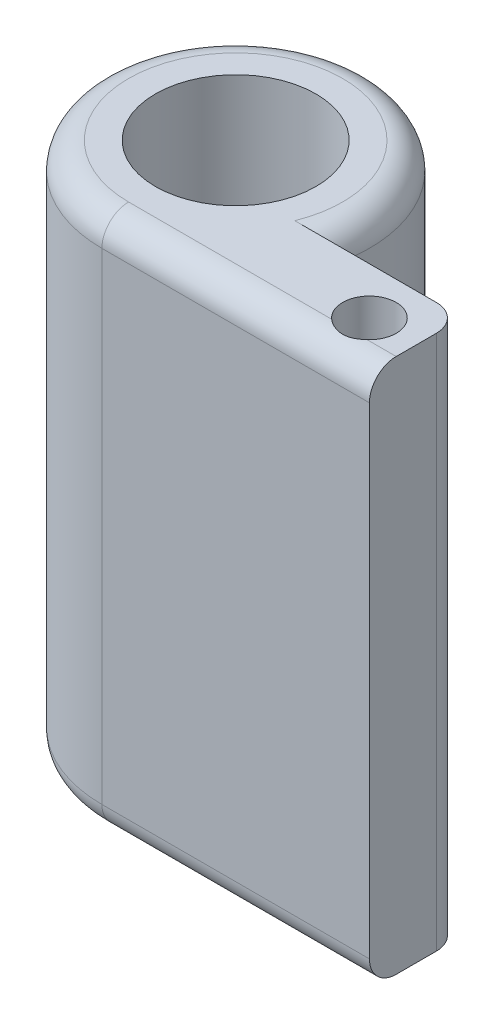
ISO-10303-21;
HEADER;
FILE_DESCRIPTION(('STEP AP214'),'2;1');
FILE_NAME('part.step','',(''),(''),'','','');
FILE_SCHEMA(('AUTOMOTIVE_DESIGN { 1 0 10303 214 1 1 1 1 }'));
ENDSEC;
DATA;
#1=APPLICATION_CONTEXT('core data for automotive mechanical design processes');
#2=APPLICATION_PROTOCOL_DEFINITION('international standard','automotive_design',2000,#1);
#3=PRODUCT_CONTEXT('',#1,'mechanical');
#4=PRODUCT('Part','Part','',(#3));
#5=PRODUCT_RELATED_PRODUCT_CATEGORY('part','',(#4));
#6=PRODUCT_DEFINITION_FORMATION('','',#4);
#7=PRODUCT_DEFINITION_CONTEXT('part definition',#1,'design');
#8=PRODUCT_DEFINITION('design','',#6,#7);
#9=PRODUCT_DEFINITION_SHAPE('','',#8);
#10=(LENGTH_UNIT() NAMED_UNIT(*) SI_UNIT(.MILLI.,.METRE.));
#11=(NAMED_UNIT(*) PLANE_ANGLE_UNIT() SI_UNIT($,.RADIAN.));
#12=(NAMED_UNIT(*) SI_UNIT($,.STERADIAN.) SOLID_ANGLE_UNIT());
#13=UNCERTAINTY_MEASURE_WITH_UNIT(LENGTH_MEASURE(1.E-05),#10,'distance_accuracy_value','');
#14=(GEOMETRIC_REPRESENTATION_CONTEXT(3) GLOBAL_UNCERTAINTY_ASSIGNED_CONTEXT((#13)) GLOBAL_UNIT_ASSIGNED_CONTEXT((#10,
#11,#12)) REPRESENTATION_CONTEXT('',''));
#15=CARTESIAN_POINT('',(0.,0.,0.));
#16=DIRECTION('',(0.,0.,1.));
#17=DIRECTION('',(1.,0.,0.));
#18=AXIS2_PLACEMENT_3D('',#15,#16,#17);
#19=CARTESIAN_POINT('',(0.,50.8,0.));
#20=DIRECTION('',(0.,-1.,0.));
#21=DIRECTION('',(0.,0.,-1.));
#22=AXIS2_PLACEMENT_3D('',#19,#20,#21);
#23=CYLINDRICAL_SURFACE('',#22,12.7);
#24=DIRECTION('',(0.,-1.,0.));
#25=VECTOR('',#24,1.);
#26=CARTESIAN_POINT('',(12.1150278579952,50.8,3.81));
#27=LINE('',#26,#25);
#28=CARTESIAN_POINT('',(12.1150278579952,2.54,3.81));
#29=VERTEX_POINT('',#28);
#30=CARTESIAN_POINT('',(12.1150278579952,48.26,3.81));
#31=VERTEX_POINT('',#30);
#32=EDGE_CURVE('E151',#29,#31,#27,.F.);
#33=ORIENTED_EDGE('',*,*,#32,.F.);
#34=CARTESIAN_POINT('',(0.,2.54,0.));
#35=DIRECTION('',(0.,1.,0.));
#36=DIRECTION('',(0.,0.,1.));
#37=AXIS2_PLACEMENT_3D('',#34,#35,#36);
#38=CIRCLE('',#37,12.7);
#39=CARTESIAN_POINT('',(0.,2.54,12.7));
#40=VERTEX_POINT('',#39);
#41=EDGE_CURVE('E236',#29,#40,#38,.T.);
#42=ORIENTED_EDGE('',*,*,#41,.T.);
#43=DIRECTION('',(0.,-1.,0.));
#44=VECTOR('',#43,1.);
#45=CARTESIAN_POINT('',(0.,50.8,12.7));
#46=LINE('',#45,#44);
#47=CARTESIAN_POINT('',(0.,48.26,12.7));
#48=VERTEX_POINT('',#47);
#49=EDGE_CURVE('E130',#48,#40,#46,.T.);
#50=ORIENTED_EDGE('',*,*,#49,.F.);
#51=CARTESIAN_POINT('',(0.,48.26,0.));
#52=DIRECTION('',(0.,1.,0.));
#53=DIRECTION('',(0.,0.,1.));
#54=AXIS2_PLACEMENT_3D('',#51,#52,#53);
#55=CIRCLE('',#54,12.7);
#56=EDGE_CURVE('E237',#48,#31,#55,.F.);
#57=ORIENTED_EDGE('',*,*,#56,.T.);
#58=EDGE_LOOP('',(#33,#42,#50,#57));
#59=FACE_BOUND('',#58,.T.);
#60=ADVANCED_FACE('F33',(#59),#23,.T.);
#61=CARTESIAN_POINT('',(0.,50.8,0.));
#62=DIRECTION('',(0.,1.,0.));
#63=DIRECTION('',(0.,0.,1.));
#64=AXIS2_PLACEMENT_3D('',#61,#62,#63);
#65=PLANE('',#64);
#66=CARTESIAN_POINT('',(0.,50.8,0.));
#67=DIRECTION('',(0.,1.,0.));
#68=DIRECTION('',(0.,0.,1.));
#69=AXIS2_PLACEMENT_3D('',#66,#67,#68);
#70=CIRCLE('',#69,7.62);
#71=CARTESIAN_POINT('',(0.,50.8,7.62));
#72=VERTEX_POINT('',#71);
#73=EDGE_CURVE('E140',#72,#72,#70,.T.);
#74=ORIENTED_EDGE('',*,*,#73,.F.);
#75=EDGE_LOOP('',(#74));
#76=FACE_BOUND('',#75,.T.);
#77=DIRECTION('',(0.,0.,1.));
#78=VECTOR('',#77,1.);
#79=CARTESIAN_POINT('',(25.4,50.8,12.7));
#80=LINE('',#79,#78);
#81=CARTESIAN_POINT('',(25.4,50.8,6.35));
#82=VERTEX_POINT('',#81);
#83=CARTESIAN_POINT('',(25.4,50.8,10.16));
#84=VERTEX_POINT('',#83);
#85=EDGE_CURVE('E134',#82,#84,#80,.T.);
#86=ORIENTED_EDGE('',*,*,#85,.F.);
#87=CARTESIAN_POINT('',(22.86,50.8,6.35));
#88=DIRECTION('',(0.,1.,0.));
#89=DIRECTION('',(0.,0.,1.));
#90=AXIS2_PLACEMENT_3D('',#87,#88,#89);
#91=CIRCLE('',#90,2.54);
#92=CARTESIAN_POINT('',(22.86,50.8,3.81));
#93=VERTEX_POINT('',#92);
#94=EDGE_CURVE('E55',#82,#93,#91,.T.);
#95=ORIENTED_EDGE('',*,*,#94,.T.);
#96=DIRECTION('',(-1.,0.,0.));
#97=VECTOR('',#96,1.);
#98=CARTESIAN_POINT('',(25.4,50.8,3.81));
#99=LINE('',#98,#97);
#100=CARTESIAN_POINT('',(9.41857207861149,50.8,3.81));
#101=VERTEX_POINT('',#100);
#102=EDGE_CURVE('E149',#93,#101,#99,.T.);
#103=ORIENTED_EDGE('',*,*,#102,.T.);
#104=CARTESIAN_POINT('',(0.,50.8,0.));
#105=DIRECTION('',(0.,1.,0.));
#106=DIRECTION('',(0.,0.,1.));
#107=AXIS2_PLACEMENT_3D('',#104,#105,#106);
#108=CIRCLE('',#107,10.16);
#109=CARTESIAN_POINT('',(0.,50.8,10.16));
#110=VERTEX_POINT('',#109);
#111=EDGE_CURVE('E246',#101,#110,#108,.T.);
#112=ORIENTED_EDGE('',*,*,#111,.T.);
#113=DIRECTION('',(-1.,0.,0.));
#114=VECTOR('',#113,1.);
#115=CARTESIAN_POINT('',(25.4,50.8,10.16));
#116=LINE('',#115,#114);
#117=CARTESIAN_POINT('',(19.2749479174741,50.8,10.16));
#118=VERTEX_POINT('',#117);
#119=EDGE_CURVE('E244',#110,#118,#116,.F.);
#120=ORIENTED_EDGE('',*,*,#119,.T.);
#121=CARTESIAN_POINT('',(20.9550000000001,50.8,8.255));
#122=DIRECTION('',(0.,1.,0.));
#123=DIRECTION('',(0.,0.,1.));
#124=AXIS2_PLACEMENT_3D('',#121,#122,#123);
#125=CIRCLE('',#124,2.54);
#126=CARTESIAN_POINT('',(22.6350520825261,50.8,10.16));
#127=VERTEX_POINT('',#126);
#128=EDGE_CURVE('E131',#127,#118,#125,.T.);
#129=ORIENTED_EDGE('',*,*,#128,.F.);
#130=DIRECTION('',(-1.,0.,0.));
#131=VECTOR('',#130,1.);
#132=CARTESIAN_POINT('',(25.4,50.8,10.16));
#133=LINE('',#132,#131);
#134=EDGE_CURVE('E239',#127,#84,#133,.F.);
#135=ORIENTED_EDGE('',*,*,#134,.T.);
#136=EDGE_LOOP('',(#86,#95,#103,#112,#120,#129,#135));
#137=FACE_BOUND('',#136,.T.);
#138=ADVANCED_FACE('F190',(#76,#137),#65,.T.);
#139=CARTESIAN_POINT('',(0.,0.,0.));
#140=DIRECTION('',(0.,1.,0.));
#141=DIRECTION('',(0.,0.,1.));
#142=AXIS2_PLACEMENT_3D('',#139,#140,#141);
#143=PLANE('',#142);
#144=CARTESIAN_POINT('',(0.,0.,0.));
#145=DIRECTION('',(0.,1.,0.));
#146=DIRECTION('',(0.,0.,1.));
#147=AXIS2_PLACEMENT_3D('',#144,#145,#146);
#148=CIRCLE('',#147,7.62);
#149=CARTESIAN_POINT('',(0.,0.,7.62));
#150=VERTEX_POINT('',#149);
#151=EDGE_CURVE('E273',#150,#150,#148,.T.);
#152=ORIENTED_EDGE('',*,*,#151,.T.);
#153=EDGE_LOOP('',(#152));
#154=FACE_BOUND('',#153,.T.);
#155=DIRECTION('',(-1.,0.,0.));
#156=VECTOR('',#155,1.);
#157=CARTESIAN_POINT('',(25.4,0.,3.80999999999999));
#158=LINE('',#157,#156);
#159=CARTESIAN_POINT('',(22.86,0.,3.80999999999999));
#160=VERTEX_POINT('',#159);
#161=CARTESIAN_POINT('',(9.41857207861149,0.,3.80999999999999));
#162=VERTEX_POINT('',#161);
#163=EDGE_CURVE('E146',#160,#162,#158,.T.);
#164=ORIENTED_EDGE('',*,*,#163,.F.);
#165=CARTESIAN_POINT('',(22.86,0.,6.34999999999999));
#166=DIRECTION('',(0.,1.,0.));
#167=DIRECTION('',(0.,0.,1.));
#168=AXIS2_PLACEMENT_3D('',#165,#166,#167);
#169=CIRCLE('',#168,2.54);
#170=CARTESIAN_POINT('',(25.4,0.,6.34999999999999));
#171=VERTEX_POINT('',#170);
#172=EDGE_CURVE('E11',#160,#171,#169,.F.);
#173=ORIENTED_EDGE('',*,*,#172,.T.);
#174=DIRECTION('',(0.,0.,-1.));
#175=VECTOR('',#174,1.);
#176=CARTESIAN_POINT('',(25.4,0.,12.7));
#177=LINE('',#176,#175);
#178=CARTESIAN_POINT('',(25.4,0.,10.16));
#179=VERTEX_POINT('',#178);
#180=EDGE_CURVE('E126',#179,#171,#177,.T.);
#181=ORIENTED_EDGE('',*,*,#180,.F.);
#182=DIRECTION('',(-1.,0.,0.));
#183=VECTOR('',#182,1.);
#184=CARTESIAN_POINT('',(0.,0.,10.16));
#185=LINE('',#184,#183);
#186=CARTESIAN_POINT('',(22.6350520825261,0.,10.16));
#187=VERTEX_POINT('',#186);
#188=EDGE_CURVE('E112',#179,#187,#185,.T.);
#189=ORIENTED_EDGE('',*,*,#188,.T.);
#190=CARTESIAN_POINT('',(20.9550000000001,0.,8.255));
#191=DIRECTION('',(0.,1.,0.));
#192=DIRECTION('',(0.,0.,1.));
#193=AXIS2_PLACEMENT_3D('',#190,#191,#192);
#194=CIRCLE('',#193,2.54);
#195=CARTESIAN_POINT('',(19.2749479174741,0.,10.16));
#196=VERTEX_POINT('',#195);
#197=EDGE_CURVE('E124',#187,#196,#194,.T.);
#198=ORIENTED_EDGE('',*,*,#197,.T.);
#199=DIRECTION('',(-1.,0.,0.));
#200=VECTOR('',#199,1.);
#201=CARTESIAN_POINT('',(0.,0.,10.16));
#202=LINE('',#201,#200);
#203=CARTESIAN_POINT('',(0.,0.,10.16));
#204=VERTEX_POINT('',#203);
#205=EDGE_CURVE('E114',#196,#204,#202,.T.);
#206=ORIENTED_EDGE('',*,*,#205,.T.);
#207=CARTESIAN_POINT('',(0.,0.,0.));
#208=DIRECTION('',(0.,1.,0.));
#209=DIRECTION('',(0.,0.,1.));
#210=AXIS2_PLACEMENT_3D('',#207,#208,#209);
#211=CIRCLE('',#210,10.16);
#212=EDGE_CURVE('E154',#204,#162,#211,.F.);
#213=ORIENTED_EDGE('',*,*,#212,.T.);
#214=EDGE_LOOP('',(#164,#173,#181,#189,#198,#206,#213));
#215=FACE_BOUND('',#214,.T.);
#216=ADVANCED_FACE('F123',(#154,#215),#143,.F.);
#217=CARTESIAN_POINT('',(25.4,50.8,3.81));
#218=DIRECTION('',(0.,0.,1.));
#219=DIRECTION('',(0.,-1.,0.));
#220=AXIS2_PLACEMENT_3D('',#217,#218,#219);
#221=PLANE('',#220);
#222=ORIENTED_EDGE('',*,*,#102,.F.);
#223=DIRECTION('',(0.,1.,0.));
#224=VECTOR('',#223,1.);
#225=CARTESIAN_POINT('',(22.86,0.,3.80999999999999));
#226=LINE('',#225,#224);
#227=EDGE_CURVE('E41',#93,#160,#226,.F.);
#228=ORIENTED_EDGE('',*,*,#227,.T.);
#229=ORIENTED_EDGE('',*,*,#163,.T.);
#230=CARTESIAN_POINT('',(9.41857207861149,0.,3.80999999999999));
#231=CARTESIAN_POINT('',(9.49853266981324,2.87958862977533E-06,3.80999999999999));
#232=CARTESIAN_POINT('',(9.57846084552517,0.00324701006212357,3.80999999999999));
#233=CARTESIAN_POINT('',(9.73780040850456,0.0162750839447691,3.80999999999999));
#234=CARTESIAN_POINT('',(9.8172116673747,0.026060593945217,3.80999999999999));
#235=CARTESIAN_POINT('',(10.0540927242047,0.065339178167798,3.80999999999999));
#236=CARTESIAN_POINT('',(10.2100472055447,0.104754541459172,3.80999999999999));
#237=CARTESIAN_POINT('',(10.5131743214163,0.209785945470495,3.80999999999999));
#238=CARTESIAN_POINT('',(10.6603294813961,0.275452253080279,3.80999999999999));
#239=CARTESIAN_POINT('',(10.9406021050595,0.431758778196787,3.80999999999999));
#240=CARTESIAN_POINT('',(11.0737353279945,0.52237053632518,3.80999999999999));
#241=CARTESIAN_POINT('',(11.3151813660293,0.721383413135085,3.80999999999999));
#242=CARTESIAN_POINT('',(11.4243896782351,0.828697669715258,3.80999999999999));
#243=CARTESIAN_POINT('',(11.62195072349,1.06116340589184,3.80999999999999));
#244=CARTESIAN_POINT('',(11.7103009717209,1.18631700784166,3.80999999999999));
#245=CARTESIAN_POINT('',(11.8583538663943,1.4431260411923,3.80999999999999));
#246=CARTESIAN_POINT('',(11.9193958148782,1.57401155256731,3.80999999999999));
#247=CARTESIAN_POINT('',(12.0175725489877,1.8443739472482,3.80999999999999));
#248=CARTESIAN_POINT('',(12.0547399874737,1.98383880920488,3.80999999999999));
#249=CARTESIAN_POINT('',(12.0911926106717,2.19384010494826,3.80999999999999));
#250=CARTESIAN_POINT('',(12.1001290678383,2.26282355098173,3.80999999999999));
#251=CARTESIAN_POINT('',(12.1120419284064,2.40119289207604,3.80999999999999));
#252=CARTESIAN_POINT('',(12.1150277612817,2.4705779754046,3.80999999999999));
#253=CARTESIAN_POINT('',(12.1150278579952,2.54,3.80999999999999));
#254=B_SPLINE_CURVE_WITH_KNOTS('',3,(#230,#231,#232,#233,#234,#235,#236,#237,#238,#239,#240,
#241,#242,#243,#244,#245,#246,#247,#248,#249,#250,#251,#252,#253),.UNSPECIFIED.,.F.,.F.,(4,2,2,
2,2,2,2,2,2,2,2,4),(0.,0.239747761464658,0.479552960565743,0.959645190988205,1.44066116850062,
1.92113063001994,2.37809989560152,2.83512357242981,3.26625805940394,3.69680162667766,
3.90526108654167,4.11338995405038),.UNSPECIFIED.);
#255=EDGE_CURVE('E194',#162,#29,#254,.T.);
#256=ORIENTED_EDGE('',*,*,#255,.T.);
#257=ORIENTED_EDGE('',*,*,#32,.T.);
#258=CARTESIAN_POINT('',(12.1150278579952,48.26,3.81));
#259=CARTESIAN_POINT('',(12.1150362966557,48.3289124583939,3.81));
#260=CARTESIAN_POINT('',(12.1120880718693,48.3978208894356,3.81));
#261=CARTESIAN_POINT('',(12.1003432451766,48.5351292652469,3.81));
#262=CARTESIAN_POINT('',(12.0915473661974,48.6035292718145,3.81));
#263=CARTESIAN_POINT('',(12.0681938767448,48.7392114217404,3.81));
#264=CARTESIAN_POINT('',(12.0536470069063,48.8064954067017,3.81));
#265=CARTESIAN_POINT('',(12.0189329045703,48.939578204648,3.81));
#266=CARTESIAN_POINT('',(11.9987656617704,49.0053770149105,3.81));
#267=CARTESIAN_POINT('',(11.9300583980327,49.199867452271,3.81));
#268=CARTESIAN_POINT('',(11.8732941522405,49.3257605562561,3.81));
#269=CARTESIAN_POINT('',(11.7397980207497,49.5663769801408,3.81));
#270=CARTESIAN_POINT('',(11.6630633993434,49.6810987667396,3.81));
#271=CARTESIAN_POINT('',(11.4906074397324,49.8984235149094,3.81));
#272=CARTESIAN_POINT('',(11.3945891433356,50.0007908525504,3.81));
#273=CARTESIAN_POINT('',(11.1873733270768,50.1887586572508,3.81));
#274=CARTESIAN_POINT('',(11.0761735786075,50.2743566581041,3.81));
#275=CARTESIAN_POINT('',(10.8366512795316,50.4304366238178,3.81));
#276=CARTESIAN_POINT('',(10.707793073608,50.5000953272541,3.81));
#277=CARTESIAN_POINT('',(10.4406323158527,50.6181317348243,3.81));
#278=CARTESIAN_POINT('',(10.3023257004752,50.6665002151046,3.81));
#279=CARTESIAN_POINT('',(10.0400668568616,50.7360309073501,3.81));
#280=CARTESIAN_POINT('',(9.91686644767488,50.7600818243913,3.81));
#281=CARTESIAN_POINT('',(9.66862673910467,50.7920672180967,3.81));
#282=CARTESIAN_POINT('',(9.54359144896289,50.8000327187265,3.81));
#283=CARTESIAN_POINT('',(9.41857207861149,50.8,3.81));
#284=B_SPLINE_CURVE_WITH_KNOTS('',3,(#258,#259,#260,#261,#262,#263,#264,#265,#266,#267,#268,
#269,#270,#271,#272,#273,#274,#275,#276,#277,#278,#279,#280,#281,#282,#283),.UNSPECIFIED.,.F.,
.F.,(4,2,2,2,2,2,2,2,2,2,2,2,4),(0.,0.206667295616528,0.413309046355896,0.619566679376151,
0.825824690479119,1.2380175923352,1.65026698954526,2.06943310594016,2.4886608213883,
2.92619440833416,3.36391736779143,3.73946036178862,4.11427835102897),.UNSPECIFIED.);
#285=EDGE_CURVE('E200',#31,#101,#284,.T.);
#286=ORIENTED_EDGE('',*,*,#285,.T.);
#287=EDGE_LOOP('',(#222,#228,#229,#256,#257,#286));
#288=FACE_BOUND('',#287,.T.);
#289=ADVANCED_FACE('F185',(#288),#221,.F.);
#290=CARTESIAN_POINT('',(25.4,50.8,12.7));
#291=DIRECTION('',(0.,0.,-1.));
#292=DIRECTION('',(-1.,0.,0.));
#293=AXIS2_PLACEMENT_3D('',#290,#291,#292);
#294=PLANE('',#293);
#295=ORIENTED_EDGE('',*,*,#49,.T.);
#296=DIRECTION('',(-1.,0.,0.));
#297=VECTOR('',#296,1.);
#298=CARTESIAN_POINT('',(25.4,2.54,12.7));
#299=LINE('',#298,#297);
#300=CARTESIAN_POINT('',(25.4,2.54,12.7));
#301=VERTEX_POINT('',#300);
#302=EDGE_CURVE('E252',#40,#301,#299,.F.);
#303=ORIENTED_EDGE('',*,*,#302,.T.);
#304=DIRECTION('',(0.,-1.,0.));
#305=VECTOR('',#304,1.);
#306=CARTESIAN_POINT('',(25.4,50.8,12.7));
#307=LINE('',#306,#305);
#308=CARTESIAN_POINT('',(25.4,48.26,12.7));
#309=VERTEX_POINT('',#308);
#310=EDGE_CURVE('E143',#309,#301,#307,.T.);
#311=ORIENTED_EDGE('',*,*,#310,.F.);
#312=DIRECTION('',(-1.,0.,0.));
#313=VECTOR('',#312,1.);
#314=CARTESIAN_POINT('',(0.,48.26,12.7));
#315=LINE('',#314,#313);
#316=EDGE_CURVE('E118',#309,#48,#315,.T.);
#317=ORIENTED_EDGE('',*,*,#316,.T.);
#318=EDGE_LOOP('',(#295,#303,#311,#317));
#319=FACE_BOUND('',#318,.T.);
#320=ADVANCED_FACE('F181',(#319),#294,.F.);
#321=CARTESIAN_POINT('',(25.4,0.,0.));
#322=DIRECTION('',(1.,0.,0.));
#323=DIRECTION('',(0.,0.,-1.));
#324=AXIS2_PLACEMENT_3D('',#321,#322,#323);
#325=PLANE('',#324);
#326=ORIENTED_EDGE('',*,*,#180,.T.);
#327=DIRECTION('',(0.,1.,0.));
#328=VECTOR('',#327,1.);
#329=CARTESIAN_POINT('',(25.4,50.8,6.35));
#330=LINE('',#329,#328);
#331=EDGE_CURVE('E206',#171,#82,#330,.T.);
#332=ORIENTED_EDGE('',*,*,#331,.T.);
#333=ORIENTED_EDGE('',*,*,#85,.T.);
#334=CARTESIAN_POINT('',(25.4,48.26,10.16));
#335=DIRECTION('',(1.,0.,0.));
#336=DIRECTION('',(0.,0.,-1.));
#337=AXIS2_PLACEMENT_3D('',#334,#335,#336);
#338=CIRCLE('',#337,2.54);
#339=EDGE_CURVE('E250',#84,#309,#338,.T.);
#340=ORIENTED_EDGE('',*,*,#339,.T.);
#341=ORIENTED_EDGE('',*,*,#310,.T.);
#342=CARTESIAN_POINT('',(25.4,2.54,10.16));
#343=DIRECTION('',(1.,0.,0.));
#344=DIRECTION('',(0.,0.,-1.));
#345=AXIS2_PLACEMENT_3D('',#342,#343,#344);
#346=CIRCLE('',#345,2.54);
#347=EDGE_CURVE('E248',#301,#179,#346,.T.);
#348=ORIENTED_EDGE('',*,*,#347,.T.);
#349=EDGE_LOOP('',(#326,#332,#333,#340,#341,#348));
#350=FACE_BOUND('',#349,.T.);
#351=ADVANCED_FACE('F176',(#350),#325,.T.);
#352=CARTESIAN_POINT('',(20.9550000000001,0.,8.255));
#353=DIRECTION('',(0.,1.,0.));
#354=DIRECTION('',(0.,0.,1.));
#355=AXIS2_PLACEMENT_3D('',#352,#353,#354);
#356=CYLINDRICAL_SURFACE('',#355,2.54);
#357=ORIENTED_EDGE('',*,*,#197,.F.);
#358=CARTESIAN_POINT('',(22.6350520825261,0.,10.16));
#359=CARTESIAN_POINT('',(22.5818547809895,5.11554411905278E-06,10.2069256277889));
#360=CARTESIAN_POINT('',(22.5267017748935,0.00130034354870158,10.2515940629395));
#361=CARTESIAN_POINT('',(22.4129307946292,0.00575861089730343,10.3361168763512));
#362=CARTESIAN_POINT('',(22.3543145006408,0.00892075111532187,10.3759735608832));
#363=CARTESIAN_POINT('',(22.2340028440654,0.0164023341829245,10.4506241967853));
#364=CARTESIAN_POINT('',(22.1723070457481,0.0207219411866063,10.4854174289662));
#365=CARTESIAN_POINT('',(22.0462704755414,0.0298667326734755,10.5497201191767));
#366=CARTESIAN_POINT('',(21.981929413151,0.0346919727755371,10.579228994966));
#367=CARTESIAN_POINT('',(21.7856263882838,0.0489974454521184,10.659494955037));
#368=CARTESIAN_POINT('',(21.6502023809868,0.0583223408975294,10.702104168805));
#369=CARTESIAN_POINT('',(21.3741048513466,0.0726938950122843,10.7641766326375));
#370=CARTESIAN_POINT('',(21.2334363635704,0.0777445517817753,10.7836615199553));
#371=CARTESIAN_POINT('',(20.9510139016913,0.0816569695847468,10.7989194016197));
#372=CARTESIAN_POINT('',(20.8092629824648,0.0805322709515904,10.794744273226));
#373=CARTESIAN_POINT('',(20.5284680937318,0.0725428596617796,10.7629193751788));
#374=CARTESIAN_POINT('',(20.3894268907481,0.0656725659968962,10.7352467807604));
#375=CARTESIAN_POINT('',(20.1198440059848,0.0489549305263377,10.6578219887989));
#376=CARTESIAN_POINT('',(19.9892156392626,0.0391472509740712,10.6083600544524));
#377=CARTESIAN_POINT('',(19.7379034557382,0.0206410959005821,10.4887339250616));
#378=CARTESIAN_POINT('',(19.6172007528436,0.011940495754195,10.4186102674284));
#379=CARTESIAN_POINT('',(19.463371852029,0.00436859184158615,10.3114524677598));
#380=CARTESIAN_POINT('',(19.4244696237472,0.00278752166105686,10.2826643793282));
#381=CARTESIAN_POINT('',(19.3483975005628,0.000603997038528382,10.2229328643317));
#382=CARTESIAN_POINT('',(19.3112257632283,4.77542140519355E-07,10.1919918218382));
#383=CARTESIAN_POINT('',(19.2749479174741,0.,10.16));
#384=B_SPLINE_CURVE_WITH_KNOTS('',3,(#358,#359,#360,#361,#362,#363,#364,#365,#366,#367,#368,
#369,#370,#371,#372,#373,#374,#375,#376,#377,#378,#379,#380,#381,#382,#383),.UNSPECIFIED.,.F.,
.F.,(4,2,2,2,2,2,2,2,2,2,2,2,4),(0.,0.212696648048886,0.425290942457063,0.637915403356918,
0.850563277225109,1.27522247437696,1.69948400712999,2.12281565893652,2.54655899400755,
2.96482058609615,3.3822669699509,3.52746270755734,3.67250014582188),.UNSPECIFIED.);
#385=EDGE_CURVE('E108',#187,#196,#384,.T.);
#386=ORIENTED_EDGE('',*,*,#385,.T.);
#387=EDGE_LOOP('',(#357,#386));
#388=FACE_BOUND('',#387,.T.);
#389=ORIENTED_EDGE('',*,*,#128,.T.);
#390=CARTESIAN_POINT('',(19.2749479174741,50.8,10.16));
#391=CARTESIAN_POINT('',(19.3281452190107,50.7999948844559,10.2069256277889));
#392=CARTESIAN_POINT('',(19.3832982251067,50.7986996564513,10.2515940629395));
#393=CARTESIAN_POINT('',(19.4970692053709,50.7942413891027,10.3361168763511));
#394=CARTESIAN_POINT('',(19.5556854993593,50.7910792488847,10.3759735608832));
#395=CARTESIAN_POINT('',(19.6759971559347,50.7835976658171,10.4506241967853));
#396=CARTESIAN_POINT('',(19.737692954252,50.7792780588134,10.4854174289662));
#397=CARTESIAN_POINT('',(19.8637295244587,50.7701332673265,10.5497201191767));
#398=CARTESIAN_POINT('',(19.9280705868491,50.7653080272245,10.579228994966));
#399=CARTESIAN_POINT('',(20.1243736117164,50.7510025545479,10.659494955037));
#400=CARTESIAN_POINT('',(20.2597976190134,50.7416776591025,10.702104168805));
#401=CARTESIAN_POINT('',(20.5358951486536,50.7273061049877,10.7641766326375));
#402=CARTESIAN_POINT('',(20.6765636364297,50.7222554482182,10.7836615199553));
#403=CARTESIAN_POINT('',(20.9589860983089,50.7183430304153,10.7989194016197));
#404=CARTESIAN_POINT('',(21.1007370175354,50.7194677290484,10.794744273226));
#405=CARTESIAN_POINT('',(21.3815319062683,50.7274571403382,10.7629193751788));
#406=CARTESIAN_POINT('',(21.520573109252,50.7343274340031,10.7352467807604));
#407=CARTESIAN_POINT('',(21.7901559940154,50.7510450694737,10.6578219887989));
#408=CARTESIAN_POINT('',(21.9207843607376,50.7608527490259,10.6083600544524));
#409=CARTESIAN_POINT('',(22.1720965442619,50.7793589040994,10.4887339250616));
#410=CARTESIAN_POINT('',(22.2927992471566,50.7880595042458,10.4186102674284));
#411=CARTESIAN_POINT('',(22.4466281479711,50.7956314081584,10.3114524677598));
#412=CARTESIAN_POINT('',(22.485530376253,50.7972124783389,10.2826643793282));
#413=CARTESIAN_POINT('',(22.5616024994373,50.7993960029615,10.2229328643317));
#414=CARTESIAN_POINT('',(22.5987742367718,50.7999995224579,10.1919918218382));
#415=CARTESIAN_POINT('',(22.6350520825261,50.8,10.16));
#416=B_SPLINE_CURVE_WITH_KNOTS('',3,(#390,#391,#392,#393,#394,#395,#396,#397,#398,#399,#400,
#401,#402,#403,#404,#405,#406,#407,#408,#409,#410,#411,#412,#413,#414,#415),.UNSPECIFIED.,.F.,
.F.,(4,2,2,2,2,2,2,2,2,2,2,2,4),(0.,0.212696648048885,0.425290942457059,0.637915403356903,
0.850563277225105,1.27522247437696,1.69948400712998,2.12281565893652,2.54655899400755,
2.96482058609615,3.3822669699509,3.52746270755734,3.67250014582188),.UNSPECIFIED.);
#417=EDGE_CURVE('E119',#118,#127,#416,.T.);
#418=ORIENTED_EDGE('',*,*,#417,.T.);
#419=EDGE_LOOP('',(#389,#418));
#420=FACE_BOUND('',#419,.T.);
#421=ADVANCED_FACE('F128',(#388,#420),#356,.F.);
#422=CARTESIAN_POINT('',(0.,2.54,0.));
#423=DIRECTION('',(0.,1.,0.));
#424=DIRECTION('',(0.,0.,1.));
#425=AXIS2_PLACEMENT_3D('',#422,#423,#424);
#426=TOROIDAL_SURFACE('',#425,10.16,2.54);
#427=ORIENTED_EDGE('',*,*,#255,.F.);
#428=ORIENTED_EDGE('',*,*,#212,.F.);
#429=CARTESIAN_POINT('',(0.,2.54,10.16));
#430=DIRECTION('',(1.,0.,0.));
#431=DIRECTION('',(0.,0.,-1.));
#432=AXIS2_PLACEMENT_3D('',#429,#430,#431);
#433=CIRCLE('',#432,2.54);
#434=EDGE_CURVE('E137',#40,#204,#433,.T.);
#435=ORIENTED_EDGE('',*,*,#434,.F.);
#436=ORIENTED_EDGE('',*,*,#41,.F.);
#437=EDGE_LOOP('',(#427,#428,#435,#436));
#438=FACE_BOUND('',#437,.T.);
#439=ADVANCED_FACE('F175',(#438),#426,.T.);
#440=CARTESIAN_POINT('',(0.,2.54,10.16));
#441=DIRECTION('',(-1.,0.,0.));
#442=DIRECTION('',(0.,0.,1.));
#443=AXIS2_PLACEMENT_3D('',#440,#441,#442);
#444=CYLINDRICAL_SURFACE('',#443,2.54);
#445=ORIENTED_EDGE('',*,*,#347,.F.);
#446=ORIENTED_EDGE('',*,*,#302,.F.);
#447=ORIENTED_EDGE('',*,*,#434,.T.);
#448=ORIENTED_EDGE('',*,*,#205,.F.);
#449=ORIENTED_EDGE('',*,*,#385,.F.);
#450=ORIENTED_EDGE('',*,*,#188,.F.);
#451=EDGE_LOOP('',(#445,#446,#447,#448,#449,#450));
#452=FACE_BOUND('',#451,.T.);
#453=ADVANCED_FACE('F111',(#452),#444,.T.);
#454=CARTESIAN_POINT('',(0.,48.26,0.));
#455=DIRECTION('',(0.,1.,0.));
#456=DIRECTION('',(0.,0.,1.));
#457=AXIS2_PLACEMENT_3D('',#454,#455,#456);
#458=TOROIDAL_SURFACE('',#457,10.16,2.54);
#459=ORIENTED_EDGE('',*,*,#285,.F.);
#460=ORIENTED_EDGE('',*,*,#56,.F.);
#461=CARTESIAN_POINT('',(0.,48.26,10.16));
#462=DIRECTION('',(1.,0.,0.));
#463=DIRECTION('',(0.,0.,-1.));
#464=AXIS2_PLACEMENT_3D('',#461,#462,#463);
#465=CIRCLE('',#464,2.54);
#466=EDGE_CURVE('E261',#110,#48,#465,.T.);
#467=ORIENTED_EDGE('',*,*,#466,.F.);
#468=ORIENTED_EDGE('',*,*,#111,.F.);
#469=EDGE_LOOP('',(#459,#460,#467,#468));
#470=FACE_BOUND('',#469,.T.);
#471=ADVANCED_FACE('F208',(#470),#458,.T.);
#472=CARTESIAN_POINT('',(25.4,48.26,10.16));
#473=DIRECTION('',(1.,0.,0.));
#474=DIRECTION('',(0.,0.,-1.));
#475=AXIS2_PLACEMENT_3D('',#472,#473,#474);
#476=CYLINDRICAL_SURFACE('',#475,2.54);
#477=ORIENTED_EDGE('',*,*,#417,.F.);
#478=ORIENTED_EDGE('',*,*,#119,.F.);
#479=ORIENTED_EDGE('',*,*,#466,.T.);
#480=ORIENTED_EDGE('',*,*,#316,.F.);
#481=ORIENTED_EDGE('',*,*,#339,.F.);
#482=ORIENTED_EDGE('',*,*,#134,.F.);
#483=EDGE_LOOP('',(#477,#478,#479,#480,#481,#482));
#484=FACE_BOUND('',#483,.T.);
#485=ADVANCED_FACE('F168',(#484),#476,.T.);
#486=CARTESIAN_POINT('',(0.,-0.17127856102616,0.));
#487=DIRECTION('',(0.,1.,0.));
#488=DIRECTION('',(0.,0.,1.));
#489=AXIS2_PLACEMENT_3D('',#486,#487,#488);
#490=CYLINDRICAL_SURFACE('',#489,7.62);
#491=ORIENTED_EDGE('',*,*,#73,.T.);
#492=EDGE_LOOP('',(#491));
#493=FACE_BOUND('',#492,.T.);
#494=ORIENTED_EDGE('',*,*,#151,.F.);
#495=EDGE_LOOP('',(#494));
#496=FACE_BOUND('',#495,.T.);
#497=ADVANCED_FACE('F177',(#493,#496),#490,.F.);
#498=CARTESIAN_POINT('',(22.86,0.,6.34999999999999));
#499=DIRECTION('',(0.,-1.,0.));
#500=DIRECTION('',(0.,0.,-1.));
#501=AXIS2_PLACEMENT_3D('',#498,#499,#500);
#502=CYLINDRICAL_SURFACE('',#501,2.54);
#503=ORIENTED_EDGE('',*,*,#172,.F.);
#504=ORIENTED_EDGE('',*,*,#227,.F.);
#505=ORIENTED_EDGE('',*,*,#94,.F.);
#506=ORIENTED_EDGE('',*,*,#331,.F.);
#507=EDGE_LOOP('',(#503,#504,#505,#506));
#508=FACE_BOUND('',#507,.T.);
#509=ADVANCED_FACE('F35',(#508),#502,.T.);
#510=CLOSED_SHELL('',(#60,#138,#216,#289,#320,#351,#421,#439,#453,#471,#485,#497,#509));
#511=MANIFOLD_SOLID_BREP('B2',#510);
#512=ADVANCED_BREP_SHAPE_REPRESENTATION('',(#18,#511),#14);
#513=SHAPE_DEFINITION_REPRESENTATION(#9,#512);
ENDSEC;
END-ISO-10303-21;
